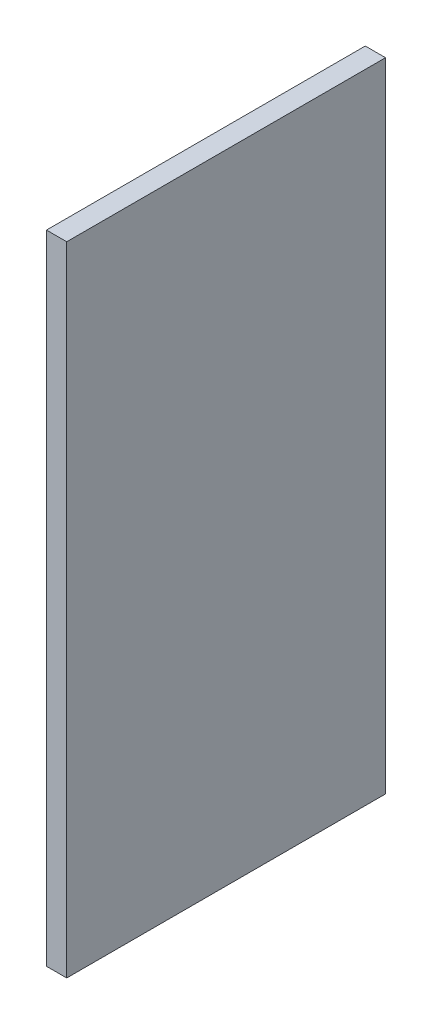
ISO-10303-21;
HEADER;
FILE_DESCRIPTION(('STEP AP214'),'2;1');
FILE_NAME('part.step','',(''),(''),'','','');
FILE_SCHEMA(('AUTOMOTIVE_DESIGN { 1 0 10303 214 1 1 1 1 }'));
ENDSEC;
DATA;
#1=APPLICATION_CONTEXT('core data for automotive mechanical design processes');
#2=APPLICATION_PROTOCOL_DEFINITION('international standard','automotive_design',2000,#1);
#3=PRODUCT_CONTEXT('',#1,'mechanical');
#4=PRODUCT('Part','Part','',(#3));
#5=PRODUCT_RELATED_PRODUCT_CATEGORY('part','',(#4));
#6=PRODUCT_DEFINITION_FORMATION('','',#4);
#7=PRODUCT_DEFINITION_CONTEXT('part definition',#1,'design');
#8=PRODUCT_DEFINITION('design','',#6,#7);
#9=PRODUCT_DEFINITION_SHAPE('','',#8);
#10=(LENGTH_UNIT() NAMED_UNIT(*) SI_UNIT(.MILLI.,.METRE.));
#11=(NAMED_UNIT(*) PLANE_ANGLE_UNIT() SI_UNIT($,.RADIAN.));
#12=(NAMED_UNIT(*) SI_UNIT($,.STERADIAN.) SOLID_ANGLE_UNIT());
#13=UNCERTAINTY_MEASURE_WITH_UNIT(LENGTH_MEASURE(1.E-05),#10,'distance_accuracy_value','');
#14=(GEOMETRIC_REPRESENTATION_CONTEXT(3) GLOBAL_UNCERTAINTY_ASSIGNED_CONTEXT((#13)) GLOBAL_UNIT_ASSIGNED_CONTEXT((#10,
#11,#12)) REPRESENTATION_CONTEXT('',''));
#15=CARTESIAN_POINT('',(0.,0.,0.));
#16=DIRECTION('',(0.,0.,1.));
#17=DIRECTION('',(1.,0.,0.));
#18=AXIS2_PLACEMENT_3D('',#15,#16,#17);
#19=CARTESIAN_POINT('',(6.35,0.,0.));
#20=DIRECTION('',(0.,0.,-1.));
#21=DIRECTION('',(0.,1.,0.));
#22=AXIS2_PLACEMENT_3D('',#19,#20,#21);
#23=PLANE('',#22);
#24=DIRECTION('',(0.,-1.,0.));
#25=VECTOR('',#24,1.);
#26=CARTESIAN_POINT('',(0.,0.,0.));
#27=LINE('',#26,#25);
#28=CARTESIAN_POINT('',(0.,0.,0.));
#29=VERTEX_POINT('',#28);
#30=CARTESIAN_POINT('',(0.,-200.,0.));
#31=VERTEX_POINT('',#30);
#32=EDGE_CURVE('E96',#29,#31,#27,.T.);
#33=ORIENTED_EDGE('',*,*,#32,.T.);
#34=DIRECTION('',(-1.,0.,0.));
#35=VECTOR('',#34,1.);
#36=CARTESIAN_POINT('',(6.35,-200.,0.));
#37=LINE('',#36,#35);
#38=CARTESIAN_POINT('',(6.35,-200.,0.));
#39=VERTEX_POINT('',#38);
#40=EDGE_CURVE('E11',#39,#31,#37,.T.);
#41=ORIENTED_EDGE('',*,*,#40,.F.);
#42=DIRECTION('',(0.,-1.,0.));
#43=VECTOR('',#42,1.);
#44=CARTESIAN_POINT('',(6.35,0.,0.));
#45=LINE('',#44,#43);
#46=CARTESIAN_POINT('',(6.35,0.,0.));
#47=VERTEX_POINT('',#46);
#48=EDGE_CURVE('E84',#47,#39,#45,.T.);
#49=ORIENTED_EDGE('',*,*,#48,.F.);
#50=DIRECTION('',(-1.,0.,0.));
#51=VECTOR('',#50,1.);
#52=CARTESIAN_POINT('',(6.35,0.,0.));
#53=LINE('',#52,#51);
#54=EDGE_CURVE('E92',#47,#29,#53,.T.);
#55=ORIENTED_EDGE('',*,*,#54,.T.);
#56=EDGE_LOOP('',(#33,#41,#49,#55));
#57=FACE_BOUND('',#56,.T.);
#58=ADVANCED_FACE('F33',(#57),#23,.F.);
#59=CARTESIAN_POINT('',(6.35,-200.,0.));
#60=DIRECTION('',(0.,1.,0.));
#61=DIRECTION('',(0.,0.,1.));
#62=AXIS2_PLACEMENT_3D('',#59,#60,#61);
#63=PLANE('',#62);
#64=DIRECTION('',(0.,0.,-1.));
#65=VECTOR('',#64,1.);
#66=CARTESIAN_POINT('',(0.,-200.,0.));
#67=LINE('',#66,#65);
#68=CARTESIAN_POINT('',(0.,-200.,-100.));
#69=VERTEX_POINT('',#68);
#70=EDGE_CURVE('E88',#31,#69,#67,.T.);
#71=ORIENTED_EDGE('',*,*,#70,.T.);
#72=DIRECTION('',(-1.,0.,0.));
#73=VECTOR('',#72,1.);
#74=CARTESIAN_POINT('',(6.35,-200.,-100.));
#75=LINE('',#74,#73);
#76=CARTESIAN_POINT('',(6.35,-200.,-100.));
#77=VERTEX_POINT('',#76);
#78=EDGE_CURVE('E41',#77,#69,#75,.T.);
#79=ORIENTED_EDGE('',*,*,#78,.F.);
#80=DIRECTION('',(0.,0.,-1.));
#81=VECTOR('',#80,1.);
#82=CARTESIAN_POINT('',(6.35,-200.,0.));
#83=LINE('',#82,#81);
#84=EDGE_CURVE('E79',#39,#77,#83,.T.);
#85=ORIENTED_EDGE('',*,*,#84,.F.);
#86=ORIENTED_EDGE('',*,*,#40,.T.);
#87=EDGE_LOOP('',(#71,#79,#85,#86));
#88=FACE_BOUND('',#87,.T.);
#89=ADVANCED_FACE('F87',(#88),#63,.F.);
#90=CARTESIAN_POINT('',(6.35,0.,-100.));
#91=DIRECTION('',(0.,0.,1.));
#92=DIRECTION('',(0.,-1.,0.));
#93=AXIS2_PLACEMENT_3D('',#90,#91,#92);
#94=PLANE('',#93);
#95=DIRECTION('',(0.,1.,0.));
#96=VECTOR('',#95,1.);
#97=CARTESIAN_POINT('',(0.,0.,-100.));
#98=LINE('',#97,#96);
#99=CARTESIAN_POINT('',(0.,0.,-100.));
#100=VERTEX_POINT('',#99);
#101=EDGE_CURVE('E66',#69,#100,#98,.T.);
#102=ORIENTED_EDGE('',*,*,#101,.T.);
#103=DIRECTION('',(-1.,0.,0.));
#104=VECTOR('',#103,1.);
#105=CARTESIAN_POINT('',(6.35,0.,-100.));
#106=LINE('',#105,#104);
#107=CARTESIAN_POINT('',(6.35,0.,-100.));
#108=VERTEX_POINT('',#107);
#109=EDGE_CURVE('E89',#108,#100,#106,.T.);
#110=ORIENTED_EDGE('',*,*,#109,.F.);
#111=DIRECTION('',(0.,1.,0.));
#112=VECTOR('',#111,1.);
#113=CARTESIAN_POINT('',(6.35,0.,-100.));
#114=LINE('',#113,#112);
#115=EDGE_CURVE('E82',#77,#108,#114,.T.);
#116=ORIENTED_EDGE('',*,*,#115,.F.);
#117=ORIENTED_EDGE('',*,*,#78,.T.);
#118=EDGE_LOOP('',(#102,#110,#116,#117));
#119=FACE_BOUND('',#118,.T.);
#120=ADVANCED_FACE('F90',(#119),#94,.F.);
#121=CARTESIAN_POINT('',(6.35,0.,0.));
#122=DIRECTION('',(0.,-1.,0.));
#123=DIRECTION('',(0.,0.,-1.));
#124=AXIS2_PLACEMENT_3D('',#121,#122,#123);
#125=PLANE('',#124);
#126=DIRECTION('',(0.,0.,1.));
#127=VECTOR('',#126,1.);
#128=CARTESIAN_POINT('',(0.,0.,0.));
#129=LINE('',#128,#127);
#130=EDGE_CURVE('E72',#100,#29,#129,.T.);
#131=ORIENTED_EDGE('',*,*,#130,.T.);
#132=ORIENTED_EDGE('',*,*,#54,.F.);
#133=DIRECTION('',(0.,0.,1.));
#134=VECTOR('',#133,1.);
#135=CARTESIAN_POINT('',(6.35,0.,0.));
#136=LINE('',#135,#134);
#137=EDGE_CURVE('E49',#108,#47,#136,.T.);
#138=ORIENTED_EDGE('',*,*,#137,.F.);
#139=ORIENTED_EDGE('',*,*,#109,.T.);
#140=EDGE_LOOP('',(#131,#132,#138,#139));
#141=FACE_BOUND('',#140,.T.);
#142=ADVANCED_FACE('F103',(#141),#125,.F.);
#143=CARTESIAN_POINT('',(6.35,0.,0.));
#144=DIRECTION('',(1.,0.,0.));
#145=DIRECTION('',(0.,0.,-1.));
#146=AXIS2_PLACEMENT_3D('',#143,#144,#145);
#147=PLANE('',#146);
#148=ORIENTED_EDGE('',*,*,#48,.T.);
#149=ORIENTED_EDGE('',*,*,#84,.T.);
#150=ORIENTED_EDGE('',*,*,#115,.T.);
#151=ORIENTED_EDGE('',*,*,#137,.T.);
#152=EDGE_LOOP('',(#148,#149,#150,#151));
#153=FACE_BOUND('',#152,.T.);
#154=ADVANCED_FACE('F80',(#153),#147,.T.);
#155=CARTESIAN_POINT('',(0.,0.,0.));
#156=DIRECTION('',(1.,0.,0.));
#157=DIRECTION('',(0.,0.,-1.));
#158=AXIS2_PLACEMENT_3D('',#155,#156,#157);
#159=PLANE('',#158);
#160=ORIENTED_EDGE('',*,*,#32,.F.);
#161=ORIENTED_EDGE('',*,*,#130,.F.);
#162=ORIENTED_EDGE('',*,*,#101,.F.);
#163=ORIENTED_EDGE('',*,*,#70,.F.);
#164=EDGE_LOOP('',(#160,#161,#162,#163));
#165=FACE_BOUND('',#164,.T.);
#166=ADVANCED_FACE('F106',(#165),#159,.F.);
#167=CLOSED_SHELL('',(#58,#89,#120,#142,#154,#166));
#168=MANIFOLD_SOLID_BREP('B2',#167);
#169=ADVANCED_BREP_SHAPE_REPRESENTATION('',(#18,#168),#14);
#170=SHAPE_DEFINITION_REPRESENTATION(#9,#169);
ENDSEC;
END-ISO-10303-21;
